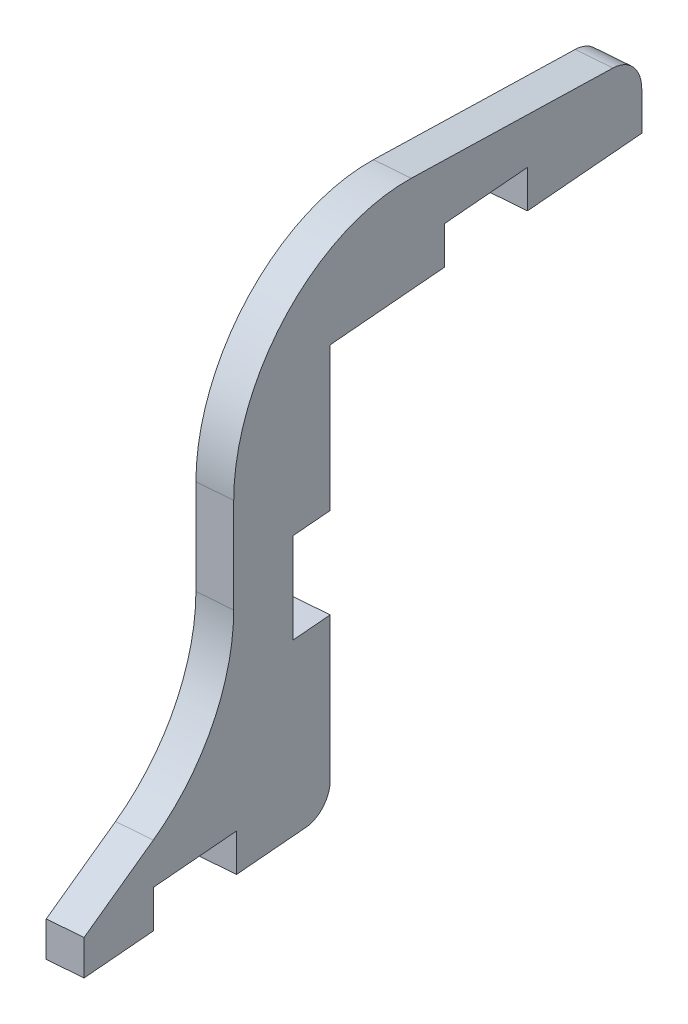
ISO-10303-21;
HEADER;
FILE_DESCRIPTION(('STEP AP214'),'2;1');
FILE_NAME('part.step','',(''),(''),'','','');
FILE_SCHEMA(('AUTOMOTIVE_DESIGN { 1 0 10303 214 1 1 1 1 }'));
ENDSEC;
DATA;
#1=APPLICATION_CONTEXT('core data for automotive mechanical design processes');
#2=APPLICATION_PROTOCOL_DEFINITION('international standard','automotive_design',2000,#1);
#3=PRODUCT_CONTEXT('',#1,'mechanical');
#4=PRODUCT('Part','Part','',(#3));
#5=PRODUCT_RELATED_PRODUCT_CATEGORY('part','',(#4));
#6=PRODUCT_DEFINITION_FORMATION('','',#4);
#7=PRODUCT_DEFINITION_CONTEXT('part definition',#1,'design');
#8=PRODUCT_DEFINITION('design','',#6,#7);
#9=PRODUCT_DEFINITION_SHAPE('','',#8);
#10=(LENGTH_UNIT() NAMED_UNIT(*) SI_UNIT(.MILLI.,.METRE.));
#11=(NAMED_UNIT(*) PLANE_ANGLE_UNIT() SI_UNIT($,.RADIAN.));
#12=(NAMED_UNIT(*) SI_UNIT($,.STERADIAN.) SOLID_ANGLE_UNIT());
#13=UNCERTAINTY_MEASURE_WITH_UNIT(LENGTH_MEASURE(1.E-05),#10,'distance_accuracy_value','');
#14=(GEOMETRIC_REPRESENTATION_CONTEXT(3) GLOBAL_UNCERTAINTY_ASSIGNED_CONTEXT((#13)) GLOBAL_UNIT_ASSIGNED_CONTEXT((#10,
#11,#12)) REPRESENTATION_CONTEXT('',''));
#15=CARTESIAN_POINT('',(0.,0.,0.));
#16=DIRECTION('',(0.,0.,1.));
#17=DIRECTION('',(1.,0.,0.));
#18=AXIS2_PLACEMENT_3D('',#15,#16,#17);
#19=CARTESIAN_POINT('',(8.92550631393653,2.29999999999999,28.5603892389756));
#20=DIRECTION('',(0.0805540927453617,0.,0.996750238596399));
#21=DIRECTION('',(0.996750238596393,0.,-0.0805540927453612));
#22=AXIS2_PLACEMENT_3D('',#19,#20,#21);
#23=PLANE('',#22);
#24=DIRECTION('',(0.996750238596393,0.,-0.0805540927453612));
#25=VECTOR('',#24,1.);
#26=CARTESIAN_POINT('',(8.92550631393653,2.29999999999999,28.5603892389756));
#27=LINE('',#26,#25);
#28=CARTESIAN_POINT('',(9.22453138551544,2.3,28.536223011152));
#29=VERTEX_POINT('',#28);
#30=CARTESIAN_POINT('',(13.211532339901,2.29999999999999,28.2140066401706));
#31=VERTEX_POINT('',#30);
#32=EDGE_CURVE('E69',#29,#31,#27,.T.);
#33=ORIENTED_EDGE('',*,*,#32,.F.);
#34=DIRECTION('',(0.,0.999999999999997,0.));
#35=VECTOR('',#34,1.);
#36=CARTESIAN_POINT('',(9.22453138551544,2.29999999999999,28.536223011152));
#37=LINE('',#36,#35);
#38=CARTESIAN_POINT('',(9.22453138551544,-1.99999999999999,28.536223011152));
#39=VERTEX_POINT('',#38);
#40=EDGE_CURVE('E11',#39,#29,#37,.T.);
#41=ORIENTED_EDGE('',*,*,#40,.F.);
#42=DIRECTION('',(-0.996750238596393,0.,0.0805540927453612));
#43=VECTOR('',#42,1.);
#44=CARTESIAN_POINT('',(17.2537625019009,-1.99999999999999,27.8873268253492));
#45=LINE('',#44,#43);
#46=CARTESIAN_POINT('',(13.211532339901,-1.99999999999999,28.2140066401706));
#47=VERTEX_POINT('',#46);
#48=EDGE_CURVE('E283',#47,#39,#45,.T.);
#49=ORIENTED_EDGE('',*,*,#48,.F.);
#50=DIRECTION('',(0.,-0.999999999999997,0.));
#51=VECTOR('',#50,1.);
#52=CARTESIAN_POINT('',(13.211532339901,2.29999999999999,28.2140066401706));
#53=LINE('',#52,#51);
#54=EDGE_CURVE('E411',#31,#47,#53,.T.);
#55=ORIENTED_EDGE('',*,*,#54,.F.);
#56=EDGE_LOOP('',(#33,#41,#49,#55));
#57=FACE_BOUND('',#56,.T.);
#58=ADVANCED_FACE('F41',(#57),#23,.T.);
#59=CARTESIAN_POINT('',(15.,-1.99999999999999,0.));
#60=DIRECTION('',(0.,-0.999999999999997,0.));
#61=DIRECTION('',(0.,0.,-1.));
#62=AXIS2_PLACEMENT_3D('',#59,#60,#61);
#63=PLANE('',#62);
#64=DIRECTION('',(0.0805540927453617,0.,0.996750238596399));
#65=VECTOR('',#64,1.);
#66=CARTESIAN_POINT('',(6.97076888361447,-1.99999999999998,0.648896185802841));
#67=LINE('',#66,#65);
#68=CARTESIAN_POINT('',(8.07978248506317,-1.99999999999999,14.3714710938828));
#69=VERTEX_POINT('',#68);
#70=EDGE_CURVE('E45',#69,#39,#67,.T.);
#71=ORIENTED_EDGE('',*,*,#70,.F.);
#72=DIRECTION('',(-0.996750238596393,0.,0.0805540927453612));
#73=VECTOR('',#72,1.);
#74=CARTESIAN_POINT('',(12.0667834394488,-1.99999999999999,14.0492547229014));
#75=LINE('',#74,#73);
#76=CARTESIAN_POINT('',(12.0667834394488,-1.99999999999999,14.0492547229014));
#77=VERTEX_POINT('',#76);
#78=EDGE_CURVE('E274',#77,#69,#75,.T.);
#79=ORIENTED_EDGE('',*,*,#78,.F.);
#80=DIRECTION('',(-0.0805540927453617,0.,-0.996750238596399));
#81=VECTOR('',#80,1.);
#82=CARTESIAN_POINT('',(15.1886147464591,-1.99999999999998,52.6777836290187));
#83=LINE('',#82,#81);
#84=EDGE_CURVE('E496',#47,#77,#83,.T.);
#85=ORIENTED_EDGE('',*,*,#84,.F.);
#86=ORIENTED_EDGE('',*,*,#48,.T.);
#87=EDGE_LOOP('',(#71,#79,#85,#86));
#88=FACE_BOUND('',#87,.T.);
#89=ADVANCED_FACE('F449',(#88),#63,.T.);
#90=CARTESIAN_POINT('',(12.0667834394488,1.99999999999999,14.0492547229014));
#91=DIRECTION('',(0.0805540927453617,0.,0.996750238596399));
#92=DIRECTION('',(0.996750238596393,0.,-0.0805540927453612));
#93=AXIS2_PLACEMENT_3D('',#90,#91,#92);
#94=PLANE('',#93);
#95=DIRECTION('',(0.,0.999999999999997,0.));
#96=VECTOR('',#95,1.);
#97=CARTESIAN_POINT('',(8.07978248506317,1.99999999999999,14.3714710938828));
#98=LINE('',#97,#96);
#99=CARTESIAN_POINT('',(8.07978248506317,2.39769989590251,14.3714710938828));
#100=VERTEX_POINT('',#99);
#101=EDGE_CURVE('E280',#69,#100,#98,.T.);
#102=ORIENTED_EDGE('',*,*,#101,.T.);
#103=DIRECTION('',(-0.996750238596393,0.,0.0805540927453612));
#104=VECTOR('',#103,1.);
#105=CARTESIAN_POINT('',(12.0667834394488,2.3976998959025,14.0492547229014));
#106=LINE('',#105,#104);
#107=CARTESIAN_POINT('',(12.0667834394488,2.3976998959025,14.0492547229014));
#108=VERTEX_POINT('',#107);
#109=EDGE_CURVE('E271',#108,#100,#106,.T.);
#110=ORIENTED_EDGE('',*,*,#109,.F.);
#111=DIRECTION('',(0.,0.999999999999997,0.));
#112=VECTOR('',#111,1.);
#113=CARTESIAN_POINT('',(12.0667834394488,1.99999999999999,14.0492547229014));
#114=LINE('',#113,#112);
#115=EDGE_CURVE('E501',#77,#108,#114,.T.);
#116=ORIENTED_EDGE('',*,*,#115,.F.);
#117=ORIENTED_EDGE('',*,*,#78,.T.);
#118=EDGE_LOOP('',(#102,#110,#116,#117));
#119=FACE_BOUND('',#118,.T.);
#120=ADVANCED_FACE('F472',(#119),#94,.F.);
#121=CARTESIAN_POINT('',(12.3889998104302,2.3976998959025,18.036255677287));
#122=DIRECTION('',(-0.996750238596393,0.,0.0805540927453612));
#123=DIRECTION('',(0.0805540927453617,0.,0.996750238596399));
#124=AXIS2_PLACEMENT_3D('',#121,#122,#123);
#125=CYLINDRICAL_SURFACE('',#124,4.);
#126=CARTESIAN_POINT('',(8.40199885604462,2.39769989590251,18.3584720482684));
#127=DIRECTION('',(0.996750238596393,0.,-0.0805540927453612));
#128=DIRECTION('',(-0.0805540927453617,0.,-0.996750238596399));
#129=AXIS2_PLACEMENT_3D('',#126,#127,#128);
#130=CIRCLE('',#129,4.);
#131=CARTESIAN_POINT('',(8.36837858795782,6.37586636228327,17.9424657462281));
#132=VERTEX_POINT('',#131);
#133=EDGE_CURVE('E272',#100,#132,#130,.T.);
#134=ORIENTED_EDGE('',*,*,#133,.T.);
#135=DIRECTION('',(-0.996750238596393,0.,0.0805540927453612));
#136=VECTOR('',#135,1.);
#137=CARTESIAN_POINT('',(12.3553795423434,6.37586636228327,17.6202493752467));
#138=LINE('',#137,#136);
#139=CARTESIAN_POINT('',(12.3553795423434,6.37586636228327,17.6202493752467));
#140=VERTEX_POINT('',#139);
#141=EDGE_CURVE('E267',#140,#132,#138,.T.);
#142=ORIENTED_EDGE('',*,*,#141,.F.);
#143=CARTESIAN_POINT('',(12.3889998104302,2.3976998959025,18.036255677287));
#144=DIRECTION('',(0.996750238596393,0.,-0.0805540927453612));
#145=DIRECTION('',(-0.0805540927453617,0.,-0.996750238596399));
#146=AXIS2_PLACEMENT_3D('',#143,#144,#145);
#147=CIRCLE('',#146,4.);
#148=EDGE_CURVE('E504',#108,#140,#147,.T.);
#149=ORIENTED_EDGE('',*,*,#148,.F.);
#150=ORIENTED_EDGE('',*,*,#109,.T.);
#151=EDGE_LOOP('',(#134,#142,#149,#150));
#152=FACE_BOUND('',#151,.T.);
#153=ADVANCED_FACE('F535',(#152),#125,.T.);
#154=CARTESIAN_POINT('',(12.3553795423434,6.37586636228327,17.6202493752467));
#155=DIRECTION('',(0.00840506702170405,-0.994541616595192,0.104001575510072));
#156=DIRECTION('',(0.,-0.104005249308261,-0.994576748228277));
#157=AXIS2_PLACEMENT_3D('',#154,#155,#156);
#158=PLANE('',#157);
#159=DIRECTION('',(0.0801143976223315,0.104340657752463,0.991309593635309));
#160=VECTOR('',#159,1.);
#161=CARTESIAN_POINT('',(8.36837858795782,6.37586636228327,17.9424657462281));
#162=LINE('',#161,#160);
#163=CARTESIAN_POINT('',(10.3890797096765,9.00761908612201,42.9459665810275));
#164=VERTEX_POINT('',#163);
#165=EDGE_CURVE('E268',#132,#164,#162,.T.);
#166=ORIENTED_EDGE('',*,*,#165,.T.);
#167=DIRECTION('',(-0.996750238596393,0.,0.0805540927453612));
#168=VECTOR('',#167,1.);
#169=CARTESIAN_POINT('',(14.3760806640621,9.00761908612201,42.6237502100461));
#170=LINE('',#169,#168);
#171=CARTESIAN_POINT('',(14.3760806640621,9.00761908612201,42.6237502100461));
#172=VERTEX_POINT('',#171);
#173=EDGE_CURVE('E263',#172,#164,#170,.T.);
#174=ORIENTED_EDGE('',*,*,#173,.F.);
#175=DIRECTION('',(0.0801143976223315,0.104340657752463,0.991309593635309));
#176=VECTOR('',#175,1.);
#177=CARTESIAN_POINT('',(12.3553795423434,6.37586636228327,17.6202493752467));
#178=LINE('',#177,#176);
#179=EDGE_CURVE('E538',#140,#172,#178,.T.);
#180=ORIENTED_EDGE('',*,*,#179,.F.);
#181=ORIENTED_EDGE('',*,*,#141,.T.);
#182=EDGE_LOOP('',(#166,#174,#180,#181));
#183=FACE_BOUND('',#182,.T.);
#184=ADVANCED_FACE('F694',(#183),#158,.F.);
#185=CARTESIAN_POINT('',(14.5441820044962,-10.8832132457818,44.7037817202476));
#186=DIRECTION('',(-0.996750238596393,0.,0.0805540927453612));
#187=DIRECTION('',(0.0805540927453617,0.,0.996750238596399));
#188=AXIS2_PLACEMENT_3D('',#185,#186,#187);
#189=CYLINDRICAL_SURFACE('',#188,20.);
#190=CARTESIAN_POINT('',(10.5571810501106,-10.8832132457818,45.025998091229));
#191=DIRECTION('',(0.996750238596393,0.,-0.0805540927453612));
#192=DIRECTION('',(-0.0805540927453617,0.,-0.996750238596399));
#193=AXIS2_PLACEMENT_3D('',#190,#191,#192);
#194=CIRCLE('',#193,20.);
#195=CARTESIAN_POINT('',(12.1682629050178,-10.8832132457818,64.961002863157));
#196=VERTEX_POINT('',#195);
#197=EDGE_CURVE('E264',#164,#196,#194,.T.);
#198=ORIENTED_EDGE('',*,*,#197,.T.);
#199=DIRECTION('',(-0.996750238596393,0.,0.0805540927453612));
#200=VECTOR('',#199,1.);
#201=CARTESIAN_POINT('',(16.1552638594034,-10.8832132457818,64.6387864921755));
#202=LINE('',#201,#200);
#203=CARTESIAN_POINT('',(16.1552638594034,-10.8832132457818,64.6387864921755));
#204=VERTEX_POINT('',#203);
#205=EDGE_CURVE('E240',#204,#196,#202,.T.);
#206=ORIENTED_EDGE('',*,*,#205,.F.);
#207=CARTESIAN_POINT('',(14.5441820044962,-10.8832132457818,44.7037817202476));
#208=DIRECTION('',(0.996750238596393,0.,-0.0805540927453612));
#209=DIRECTION('',(-0.0805540927453617,0.,-0.996750238596399));
#210=AXIS2_PLACEMENT_3D('',#207,#208,#209);
#211=CIRCLE('',#210,20.);
#212=EDGE_CURVE('E541',#172,#204,#211,.T.);
#213=ORIENTED_EDGE('',*,*,#212,.F.);
#214=ORIENTED_EDGE('',*,*,#173,.T.);
#215=EDGE_LOOP('',(#198,#206,#213,#214));
#216=FACE_BOUND('',#215,.T.);
#217=ADVANCED_FACE('F686',(#216),#189,.T.);
#218=CARTESIAN_POINT('',(16.1552638594034,-10.8832132457818,64.6387864921755));
#219=DIRECTION('',(-0.0805540927453617,0.,-0.996750238596399));
#220=DIRECTION('',(-0.996750238596393,0.,0.0805540927453612));
#221=AXIS2_PLACEMENT_3D('',#218,#219,#220);
#222=PLANE('',#221);
#223=DIRECTION('',(0.,-0.999999999999997,0.));
#224=VECTOR('',#223,1.);
#225=CARTESIAN_POINT('',(12.1682629050178,-10.8832132457818,64.961002863157));
#226=LINE('',#225,#224);
#227=CARTESIAN_POINT('',(12.1682629050178,-21.7049434551083,64.9610028631568));
#228=VERTEX_POINT('',#227);
#229=EDGE_CURVE('E260',#196,#228,#226,.T.);
#230=ORIENTED_EDGE('',*,*,#229,.T.);
#231=DIRECTION('',(-0.996750238596393,0.,0.0805540927453612));
#232=VECTOR('',#231,1.);
#233=CARTESIAN_POINT('',(16.1552638594034,-21.7049434551083,64.6387864921756));
#234=LINE('',#233,#232);
#235=CARTESIAN_POINT('',(16.1552638594034,-21.7049434551083,64.6387864921756));
#236=VERTEX_POINT('',#235);
#237=EDGE_CURVE('E235',#236,#228,#234,.T.);
#238=ORIENTED_EDGE('',*,*,#237,.F.);
#239=DIRECTION('',(0.,-0.999999999999997,0.));
#240=VECTOR('',#239,1.);
#241=CARTESIAN_POINT('',(16.1552638594034,-10.8832132457818,64.6387864921755));
#242=LINE('',#241,#240);
#243=EDGE_CURVE('E545',#204,#236,#242,.T.);
#244=ORIENTED_EDGE('',*,*,#243,.F.);
#245=ORIENTED_EDGE('',*,*,#205,.T.);
#246=EDGE_LOOP('',(#230,#238,#244,#245));
#247=FACE_BOUND('',#246,.T.);
#248=ADVANCED_FACE('F679',(#247),#222,.F.);
#249=CARTESIAN_POINT('',(17.7663457143106,-21.7049434551083,84.5737912641035));
#250=DIRECTION('',(-0.996750238596393,0.,0.0805540927453612));
#251=DIRECTION('',(0.0805540927453617,0.,0.996750238596399));
#252=AXIS2_PLACEMENT_3D('',#249,#250,#251);
#253=CYLINDRICAL_SURFACE('',#252,20.);
#254=CARTESIAN_POINT('',(13.7793447599251,-21.7049434551083,84.8960076350849));
#255=DIRECTION('',(-0.996750238596393,0.,0.0805540927453612));
#256=DIRECTION('',(0.0805540927453617,0.,0.996750238596399));
#257=AXIS2_PLACEMENT_3D('',#254,#255,#256);
#258=CIRCLE('',#257,20.);
#259=CARTESIAN_POINT('',(12.9738038324715,-39.025451530797,74.9285052491208));
#260=VERTEX_POINT('',#259);
#261=EDGE_CURVE('E228',#228,#260,#258,.T.);
#262=ORIENTED_EDGE('',*,*,#261,.T.);
#263=DIRECTION('',(-0.996750238596393,0.,0.0805540927453612));
#264=VECTOR('',#263,1.);
#265=CARTESIAN_POINT('',(16.9608047868571,-39.025451530797,74.6062888781396));
#266=LINE('',#265,#264);
#267=CARTESIAN_POINT('',(16.9608047868571,-39.025451530797,74.6062888781396));
#268=VERTEX_POINT('',#267);
#269=EDGE_CURVE('E232',#268,#260,#266,.T.);
#270=ORIENTED_EDGE('',*,*,#269,.F.);
#271=CARTESIAN_POINT('',(17.7663457143106,-21.7049434551083,84.5737912641035));
#272=DIRECTION('',(-0.996750238596393,0.,0.0805540927453612));
#273=DIRECTION('',(0.0805540927453617,0.,0.996750238596399));
#274=AXIS2_PLACEMENT_3D('',#271,#272,#273);
#275=CIRCLE('',#274,20.);
#276=EDGE_CURVE('E547',#236,#268,#275,.T.);
#277=ORIENTED_EDGE('',*,*,#276,.F.);
#278=ORIENTED_EDGE('',*,*,#237,.T.);
#279=EDGE_LOOP('',(#262,#270,#277,#278));
#280=FACE_BOUND('',#279,.T.);
#281=ADVANCED_FACE('F230',(#280),#253,.F.);
#282=CARTESIAN_POINT('',(16.9608047868571,-39.025451530797,74.6062888781396));
#283=DIRECTION('',(-0.040277046372681,-0.866025403784435,-0.498375119298202));
#284=DIRECTION('',(0.,0.498779853940022,-0.866728710326117));
#285=AXIS2_PLACEMENT_3D('',#282,#283,#284);
#286=PLANE('',#285);
#287=DIRECTION('',(0.0697618906962911,-0.499999999999999,0.863211027852679));
#288=VECTOR('',#287,1.);
#289=CARTESIAN_POINT('',(12.9738038324715,-39.025451530797,74.9285052491208));
#290=LINE('',#289,#288);
#291=CARTESIAN_POINT('',(13.6678716456153,-43.9999999999998,83.5166754435282));
#292=VERTEX_POINT('',#291);
#293=EDGE_CURVE('E246',#260,#292,#290,.T.);
#294=ORIENTED_EDGE('',*,*,#293,.T.);
#295=DIRECTION('',(-0.996750238596393,0.,0.0805540927453612));
#296=VECTOR('',#295,1.);
#297=CARTESIAN_POINT('',(17.6548726000009,-43.9999999999998,83.1944590725466));
#298=LINE('',#297,#296);
#299=CARTESIAN_POINT('',(17.6548726000009,-43.9999999999998,83.1944590725466));
#300=VERTEX_POINT('',#299);
#301=EDGE_CURVE('E286',#300,#292,#298,.T.);
#302=ORIENTED_EDGE('',*,*,#301,.F.);
#303=DIRECTION('',(0.0697618906962911,-0.499999999999999,0.863211027852679));
#304=VECTOR('',#303,1.);
#305=CARTESIAN_POINT('',(16.9608047868571,-39.025451530797,74.6062888781396));
#306=LINE('',#305,#304);
#307=EDGE_CURVE('E248',#268,#300,#306,.T.);
#308=ORIENTED_EDGE('',*,*,#307,.F.);
#309=ORIENTED_EDGE('',*,*,#269,.T.);
#310=EDGE_LOOP('',(#294,#302,#308,#309));
#311=FACE_BOUND('',#310,.T.);
#312=ADVANCED_FACE('F244',(#311),#286,.F.);
#313=CARTESIAN_POINT('',(17.6548726000009,-43.9999999999998,83.1944590725466));
#314=DIRECTION('',(-0.0805540927453617,0.,-0.996750238596399));
#315=DIRECTION('',(-0.996750238596393,0.,0.0805540927453612));
#316=AXIS2_PLACEMENT_3D('',#313,#314,#315);
#317=PLANE('',#316);
#318=DIRECTION('',(0.,-0.999999999999997,0.));
#319=VECTOR('',#318,1.);
#320=CARTESIAN_POINT('',(13.6678716456153,-47.9999999999999,83.5166754435282));
#321=LINE('',#320,#319);
#322=CARTESIAN_POINT('',(13.6678716456153,-47.9999999999999,83.5166754435282));
#323=VERTEX_POINT('',#322);
#324=EDGE_CURVE('E249',#292,#323,#321,.T.);
#325=ORIENTED_EDGE('',*,*,#324,.T.);
#326=DIRECTION('',(-0.996750238596393,0.,0.0805540927453612));
#327=VECTOR('',#326,1.);
#328=CARTESIAN_POINT('',(17.6548726000009,-47.9999999999998,83.1944590725466));
#329=LINE('',#328,#327);
#330=CARTESIAN_POINT('',(17.6548726000009,-47.9999999999998,83.1944590725466));
#331=VERTEX_POINT('',#330);
#332=EDGE_CURVE('E308',#331,#323,#329,.T.);
#333=ORIENTED_EDGE('',*,*,#332,.F.);
#334=DIRECTION('',(0.,-0.999999999999997,0.));
#335=VECTOR('',#334,1.);
#336=CARTESIAN_POINT('',(17.6548726000009,-43.9999999999998,83.1944590725466));
#337=LINE('',#336,#335);
#338=EDGE_CURVE('E393',#300,#331,#337,.T.);
#339=ORIENTED_EDGE('',*,*,#338,.F.);
#340=ORIENTED_EDGE('',*,*,#301,.T.);
#341=EDGE_LOOP('',(#325,#333,#339,#340));
#342=FACE_BOUND('',#341,.T.);
#343=ADVANCED_FACE('F438',(#342),#317,.F.);
#344=CARTESIAN_POINT('',(15.,-47.9999999999998,56.0000000000002));
#345=DIRECTION('',(0.,-0.999999999999997,0.));
#346=DIRECTION('',(0.,0.,-1.));
#347=AXIS2_PLACEMENT_3D('',#344,#345,#346);
#348=PLANE('',#347);
#349=DIRECTION('',(0.0805540927453617,0.,0.996750238596399));
#350=VECTOR('',#349,1.);
#351=CARTESIAN_POINT('',(11.4671383087904,-47.9999999999998,56.2855143217534));
#352=LINE('',#351,#350);
#353=CARTESIAN_POINT('',(12.9721345636397,-47.9999999999998,74.9078502575536));
#354=VERTEX_POINT('',#353);
#355=EDGE_CURVE('E378',#354,#323,#352,.T.);
#356=ORIENTED_EDGE('',*,*,#355,.F.);
#357=DIRECTION('',(0.996750238596393,0.,-0.0805540927453612));
#358=VECTOR('',#357,1.);
#359=CARTESIAN_POINT('',(16.5049962548493,-47.9999999999998,74.6223359358003));
#360=LINE('',#359,#358);
#361=CARTESIAN_POINT('',(16.9591355180253,-47.9999999999998,74.5856338865722));
#362=VERTEX_POINT('',#361);
#363=EDGE_CURVE('E307',#354,#362,#360,.T.);
#364=ORIENTED_EDGE('',*,*,#363,.T.);
#365=DIRECTION('',(-0.0805540927453616,0.,-0.996750238596399));
#366=VECTOR('',#365,1.);
#367=CARTESIAN_POINT('',(15.4310649299438,-47.9999999999998,55.6777836290187));
#368=LINE('',#367,#366);
#369=EDGE_CURVE('E374',#331,#362,#368,.T.);
#370=ORIENTED_EDGE('',*,*,#369,.F.);
#371=ORIENTED_EDGE('',*,*,#332,.T.);
#372=EDGE_LOOP('',(#356,#364,#370,#371));
#373=FACE_BOUND('',#372,.T.);
#374=ADVANCED_FACE('F468',(#373),#348,.T.);
#375=CARTESIAN_POINT('',(12.6731094920607,-49.9335699268316,74.9320164853772));
#376=DIRECTION('',(-0.0805540927453617,0.,-0.996750238596399));
#377=DIRECTION('',(-0.996750238596393,0.,0.0805540927453612));
#378=AXIS2_PLACEMENT_3D('',#375,#376,#377);
#379=PLANE('',#378);
#380=ORIENTED_EDGE('',*,*,#363,.F.);
#381=DIRECTION('',(0.,0.999999999999997,0.));
#382=VECTOR('',#381,1.);
#383=CARTESIAN_POINT('',(12.9721345636397,-44.9999999999998,74.9078502575534));
#384=LINE('',#383,#382);
#385=CARTESIAN_POINT('',(12.9721345636397,-43.6999999999998,74.9078502575534));
#386=VERTEX_POINT('',#385);
#387=EDGE_CURVE('E311',#354,#386,#384,.T.);
#388=ORIENTED_EDGE('',*,*,#387,.T.);
#389=DIRECTION('',(0.996750238596393,0.,-0.0805540927453612));
#390=VECTOR('',#389,1.);
#391=CARTESIAN_POINT('',(12.6731094920607,-43.6999999999998,74.9320164853772));
#392=LINE('',#391,#390);
#393=CARTESIAN_POINT('',(16.9591355180253,-43.6999999999998,74.5856338865722));
#394=VERTEX_POINT('',#393);
#395=EDGE_CURVE('E365',#386,#394,#392,.T.);
#396=ORIENTED_EDGE('',*,*,#395,.T.);
#397=DIRECTION('',(0.,0.999999999999997,0.));
#398=VECTOR('',#397,1.);
#399=CARTESIAN_POINT('',(16.9591355180253,-49.9335699268316,74.5856338865722));
#400=LINE('',#399,#398);
#401=EDGE_CURVE('E369',#362,#394,#400,.T.);
#402=ORIENTED_EDGE('',*,*,#401,.F.);
#403=EDGE_LOOP('',(#380,#388,#396,#402));
#404=FACE_BOUND('',#403,.T.);
#405=ADVANCED_FACE('F465',(#404),#379,.T.);
#406=CARTESIAN_POINT('',(-17.6548726000008,-43.6999999999998,64.4361213507827));
#407=DIRECTION('',(0.,0.999999999999997,0.));
#408=DIRECTION('',(0.,0.,1.));
#409=AXIS2_PLACEMENT_3D('',#406,#407,#408);
#410=PLANE('',#409);
#411=DIRECTION('',(0.0805540927453617,0.,0.996750238596399));
#412=VECTOR('',#411,1.);
#413=CARTESIAN_POINT('',(11.4440639755582,-43.6999999999998,56.0000000000002));
#414=LINE('',#413,#412);
#415=CARTESIAN_POINT('',(12.1398010575338,-43.6999999999998,64.6088251859744));
#416=VERTEX_POINT('',#415);
#417=EDGE_CURVE('E377',#416,#386,#414,.T.);
#418=ORIENTED_EDGE('',*,*,#417,.F.);
#419=DIRECTION('',(0.996750238596393,0.,-0.0805540927453612));
#420=VECTOR('',#419,1.);
#421=CARTESIAN_POINT('',(11.8407759859549,-43.6999999999998,64.6329914137981));
#422=LINE('',#421,#420);
#423=CARTESIAN_POINT('',(16.1268020119194,-43.6999999999998,64.2866088149932));
#424=VERTEX_POINT('',#423);
#425=EDGE_CURVE('E58',#416,#424,#422,.T.);
#426=ORIENTED_EDGE('',*,*,#425,.T.);
#427=DIRECTION('',(0.0805540927453617,0.,0.996750238596399));
#428=VECTOR('',#427,1.);
#429=CARTESIAN_POINT('',(15.4310649299438,-43.6999999999998,55.6777836290188));
#430=LINE('',#429,#428);
#431=EDGE_CURVE('E513',#424,#394,#430,.T.);
#432=ORIENTED_EDGE('',*,*,#431,.T.);
#433=ORIENTED_EDGE('',*,*,#395,.F.);
#434=EDGE_LOOP('',(#418,#426,#432,#433));
#435=FACE_BOUND('',#434,.T.);
#436=ADVANCED_FACE('F453',(#435),#410,.F.);
#437=CARTESIAN_POINT('',(11.8407759859549,-43.6999999999998,64.6329914137981));
#438=DIRECTION('',(0.0805540927453617,0.,0.996750238596399));
#439=DIRECTION('',(0.996750238596393,0.,-0.0805540927453612));
#440=AXIS2_PLACEMENT_3D('',#437,#438,#439);
#441=PLANE('',#440);
#442=ORIENTED_EDGE('',*,*,#425,.F.);
#443=DIRECTION('',(0.,0.999999999999997,0.));
#444=VECTOR('',#443,1.);
#445=CARTESIAN_POINT('',(12.1398010575338,-43.6999999999998,64.6088251859744));
#446=LINE('',#445,#444);
#447=CARTESIAN_POINT('',(12.1398010575338,-47.9999999999998,64.6088251859744));
#448=VERTEX_POINT('',#447);
#449=EDGE_CURVE('E375',#448,#416,#446,.T.);
#450=ORIENTED_EDGE('',*,*,#449,.F.);
#451=DIRECTION('',(-0.996750238596393,0.,0.0805540927453612));
#452=VECTOR('',#451,1.);
#453=CARTESIAN_POINT('',(15.6726627487435,-47.9999999999998,64.3233108642212));
#454=LINE('',#453,#452);
#455=CARTESIAN_POINT('',(16.1268020119194,-47.9999999999998,64.2866088149932));
#456=VERTEX_POINT('',#455);
#457=EDGE_CURVE('E291',#456,#448,#454,.T.);
#458=ORIENTED_EDGE('',*,*,#457,.F.);
#459=DIRECTION('',(0.,-0.999999999999997,0.));
#460=VECTOR('',#459,1.);
#461=CARTESIAN_POINT('',(16.1268020119194,-43.6999999999998,64.2866088149932));
#462=LINE('',#461,#460);
#463=EDGE_CURVE('E373',#424,#456,#462,.T.);
#464=ORIENTED_EDGE('',*,*,#463,.F.);
#465=EDGE_LOOP('',(#442,#450,#458,#464));
#466=FACE_BOUND('',#465,.T.);
#467=ADVANCED_FACE('F450',(#466),#441,.T.);
#468=CARTESIAN_POINT('',(11.4440639755582,-47.9999999999998,56.0000000000002));
#469=VERTEX_POINT('',#468);
#470=EDGE_CURVE('E355',#469,#448,#352,.T.);
#471=ORIENTED_EDGE('',*,*,#470,.F.);
#472=DIRECTION('',(-0.996750238596393,0.,0.0805540927453612));
#473=VECTOR('',#472,1.);
#474=CARTESIAN_POINT('',(15.4310649299438,-47.9999999999998,55.6777836290187));
#475=LINE('',#474,#473);
#476=CARTESIAN_POINT('',(15.4310649299438,-47.9999999999998,55.6777836290187));
#477=VERTEX_POINT('',#476);
#478=EDGE_CURVE('E290',#477,#469,#475,.T.);
#479=ORIENTED_EDGE('',*,*,#478,.F.);
#480=EDGE_CURVE('E426',#456,#477,#368,.T.);
#481=ORIENTED_EDGE('',*,*,#480,.F.);
#482=ORIENTED_EDGE('',*,*,#457,.T.);
#483=EDGE_LOOP('',(#471,#479,#481,#482));
#484=FACE_BOUND('',#483,.T.);
#485=ADVANCED_FACE('F436',(#484),#348,.T.);
#486=CARTESIAN_POINT('',(15.4310649299438,-44.9999999999998,55.6777836290188));
#487=DIRECTION('',(0.996750238596393,0.,-0.0805540927453612));
#488=DIRECTION('',(-0.0805540927453617,0.,-0.996750238596399));
#489=AXIS2_PLACEMENT_3D('',#486,#487,#488);
#490=ELLIPSE('',#489,3.00978107035575,3.);
#491=DIRECTION('',(-0.996750238596393,0.,0.0805540927453612));
#492=VECTOR('',#491,1.);
#493=SURFACE_OF_LINEAR_EXTRUSION('',#490,#492);
#494=CARTESIAN_POINT('',(11.4440639755582,-44.9999999999998,56.0000000000002));
#495=DIRECTION('',(-0.996750238596393,0.,0.0805540927453612));
#496=DIRECTION('',(-0.0805540927453617,0.,-0.996750238596399));
#497=AXIS2_PLACEMENT_3D('',#494,#495,#496);
#498=ELLIPSE('',#497,3.00978107035574,3.);
#499=CARTESIAN_POINT('',(11.2016137920735,-44.9999999999998,53.0000000000002));
#500=VERTEX_POINT('',#499);
#501=EDGE_CURVE('E287',#469,#500,#498,.F.);
#502=ORIENTED_EDGE('',*,*,#501,.T.);
#503=DIRECTION('',(-0.996750238596393,0.,0.0805540927453612));
#504=VECTOR('',#503,1.);
#505=CARTESIAN_POINT('',(15.1886147464591,-44.9999999999998,52.6777836290187));
#506=LINE('',#505,#504);
#507=CARTESIAN_POINT('',(15.1886147464591,-44.9999999999998,52.6777836290187));
#508=VERTEX_POINT('',#507);
#509=EDGE_CURVE('E313',#508,#500,#506,.T.);
#510=ORIENTED_EDGE('',*,*,#509,.F.);
#511=EDGE_CURVE('E424',#477,#508,#490,.T.);
#512=ORIENTED_EDGE('',*,*,#511,.F.);
#513=ORIENTED_EDGE('',*,*,#478,.T.);
#514=EDGE_LOOP('',(#502,#510,#512,#513));
#515=FACE_BOUND('',#514,.T.);
#516=ADVANCED_FACE('F431',(#515),#493,.F.);
#517=CARTESIAN_POINT('',(15.1886147464591,-44.9999999999998,52.6777836290187));
#518=DIRECTION('',(0.0805540927453617,0.,0.996750238596399));
#519=DIRECTION('',(0.996750238596393,0.,-0.0805540927453612));
#520=AXIS2_PLACEMENT_3D('',#517,#518,#519);
#521=PLANE('',#520);
#522=DIRECTION('',(0.,0.999999999999997,0.));
#523=VECTOR('',#522,1.);
#524=CARTESIAN_POINT('',(11.2016137920735,-0.999999999999989,53.0000000000002));
#525=LINE('',#524,#523);
#526=CARTESIAN_POINT('',(11.2016137920735,-28.6499999999999,53.0000000000001));
#527=VERTEX_POINT('',#526);
#528=EDGE_CURVE('E292',#500,#527,#525,.T.);
#529=ORIENTED_EDGE('',*,*,#528,.T.);
#530=DIRECTION('',(0.996750238596393,0.,-0.0805540927453612));
#531=VECTOR('',#530,1.);
#532=CARTESIAN_POINT('',(15.1886147464591,-28.6499999999999,52.6777836290187));
#533=LINE('',#532,#531);
#534=CARTESIAN_POINT('',(15.1886147464591,-28.6499999999999,52.6777836290187));
#535=VERTEX_POINT('',#534);
#536=EDGE_CURVE('E295',#527,#535,#533,.T.);
#537=ORIENTED_EDGE('',*,*,#536,.T.);
#538=DIRECTION('',(0.,0.999999999999997,0.));
#539=VECTOR('',#538,1.);
#540=CARTESIAN_POINT('',(15.1886147464591,-44.9999999999998,52.6777836290187));
#541=LINE('',#540,#539);
#542=EDGE_CURVE('E277',#508,#535,#541,.T.);
#543=ORIENTED_EDGE('',*,*,#542,.F.);
#544=ORIENTED_EDGE('',*,*,#509,.T.);
#545=EDGE_LOOP('',(#529,#537,#543,#544));
#546=FACE_BOUND('',#545,.T.);
#547=ADVANCED_FACE('F435',(#546),#521,.F.);
#548=CARTESIAN_POINT('',(11.2761411229114,-28.6499999999999,57.6463825988052));
#549=DIRECTION('',(0.,-0.999999999999997,0.));
#550=DIRECTION('',(0.999999999999997,0.,0.));
#551=AXIS2_PLACEMENT_3D('',#548,#549,#550);
#552=PLANE('',#551);
#553=ORIENTED_EDGE('',*,*,#536,.F.);
#554=DIRECTION('',(-0.0805540927453617,0.,-0.996750238596399));
#555=VECTOR('',#554,1.);
#556=CARTESIAN_POINT('',(11.4440639755582,-28.6499999999999,56.0000000000002));
#557=LINE('',#556,#555);
#558=CARTESIAN_POINT('',(11.5751661944903,-28.6499999999999,57.6222163709816));
#559=VERTEX_POINT('',#558);
#560=EDGE_CURVE('E353',#559,#527,#557,.T.);
#561=ORIENTED_EDGE('',*,*,#560,.F.);
#562=DIRECTION('',(0.996750238596393,0.,-0.0805540927453612));
#563=VECTOR('',#562,1.);
#564=CARTESIAN_POINT('',(11.2761411229114,-28.6499999999999,57.6463825988052));
#565=LINE('',#564,#563);
#566=CARTESIAN_POINT('',(15.5621671488759,-28.6499999999999,57.3000000000002));
#567=VERTEX_POINT('',#566);
#568=EDGE_CURVE('E315',#559,#567,#565,.T.);
#569=ORIENTED_EDGE('',*,*,#568,.T.);
#570=DIRECTION('',(-0.0805540927453617,0.,-0.996750238596399));
#571=VECTOR('',#570,1.);
#572=CARTESIAN_POINT('',(15.5621671488759,-28.6499999999999,57.3000000000002));
#573=LINE('',#572,#571);
#574=EDGE_CURVE('E320',#567,#535,#573,.T.);
#575=ORIENTED_EDGE('',*,*,#574,.T.);
#576=EDGE_LOOP('',(#553,#561,#569,#575));
#577=FACE_BOUND('',#576,.T.);
#578=ADVANCED_FACE('F418',(#577),#552,.F.);
#579=CARTESIAN_POINT('',(11.2761411229114,-28.3499999999999,57.6463825988052));
#580=DIRECTION('',(0.0805540927453617,0.,0.996750238596399));
#581=DIRECTION('',(0.996750238596393,0.,-0.0805540927453612));
#582=AXIS2_PLACEMENT_3D('',#579,#580,#581);
#583=PLANE('',#582);
#584=ORIENTED_EDGE('',*,*,#568,.F.);
#585=DIRECTION('',(0.,-0.999999999999997,0.));
#586=VECTOR('',#585,1.);
#587=CARTESIAN_POINT('',(11.5751661944903,-44.9999999999998,57.6222163709816));
#588=LINE('',#587,#586);
#589=CARTESIAN_POINT('',(11.5751661944903,-18.3499999999999,57.6222163709816));
#590=VERTEX_POINT('',#589);
#591=EDGE_CURVE('E356',#590,#559,#588,.T.);
#592=ORIENTED_EDGE('',*,*,#591,.F.);
#593=DIRECTION('',(0.996750238596393,0.,-0.0805540927453612));
#594=VECTOR('',#593,1.);
#595=CARTESIAN_POINT('',(11.2761411229114,-18.3499999999999,57.6463825988052));
#596=LINE('',#595,#594);
#597=CARTESIAN_POINT('',(15.5621671488759,-18.3499999999999,57.3000000000001));
#598=VERTEX_POINT('',#597);
#599=EDGE_CURVE('E341',#590,#598,#596,.T.);
#600=ORIENTED_EDGE('',*,*,#599,.T.);
#601=DIRECTION('',(0.,-0.999999999999997,0.));
#602=VECTOR('',#601,1.);
#603=CARTESIAN_POINT('',(15.5621671488759,-28.3499999999999,57.3000000000002));
#604=LINE('',#603,#602);
#605=EDGE_CURVE('E349',#598,#567,#604,.T.);
#606=ORIENTED_EDGE('',*,*,#605,.T.);
#607=EDGE_LOOP('',(#584,#592,#600,#606));
#608=FACE_BOUND('',#607,.T.);
#609=ADVANCED_FACE('F419',(#608),#583,.F.);
#610=CARTESIAN_POINT('',(10.673915039266,-18.3499999999999,50.194632202212));
#611=DIRECTION('',(0.,0.999999999999997,0.));
#612=DIRECTION('',(-0.999999999999997,0.,0.));
#613=AXIS2_PLACEMENT_3D('',#610,#611,#612);
#614=PLANE('',#613);
#615=DIRECTION('',(0.0805540927453617,0.,0.996750238596399));
#616=VECTOR('',#615,1.);
#617=CARTESIAN_POINT('',(11.4440639755582,-18.3499999999999,56.0000000000002));
#618=LINE('',#617,#616);
#619=CARTESIAN_POINT('',(11.2016137920735,-18.3499999999999,53.0000000000002));
#620=VERTEX_POINT('',#619);
#621=EDGE_CURVE('E383',#620,#590,#618,.T.);
#622=ORIENTED_EDGE('',*,*,#621,.F.);
#623=DIRECTION('',(-0.996750238596393,0.,0.0805540927453612));
#624=VECTOR('',#623,1.);
#625=CARTESIAN_POINT('',(15.1886147464591,-18.3499999999999,52.6777836290187));
#626=LINE('',#625,#624);
#627=CARTESIAN_POINT('',(15.1886147464591,-18.3499999999999,52.6777836290187));
#628=VERTEX_POINT('',#627);
#629=EDGE_CURVE('E328',#628,#620,#626,.T.);
#630=ORIENTED_EDGE('',*,*,#629,.F.);
#631=DIRECTION('',(0.0805540927453617,0.,0.996750238596399));
#632=VECTOR('',#631,1.);
#633=CARTESIAN_POINT('',(14.9599410652305,-18.3499999999999,49.848249603407));
#634=LINE('',#633,#632);
#635=EDGE_CURVE('E331',#628,#598,#634,.T.);
#636=ORIENTED_EDGE('',*,*,#635,.T.);
#637=ORIENTED_EDGE('',*,*,#599,.F.);
#638=EDGE_LOOP('',(#622,#630,#636,#637));
#639=FACE_BOUND('',#638,.T.);
#640=ADVANCED_FACE('F444',(#639),#614,.F.);
#641=CARTESIAN_POINT('',(15.1886147464591,-1.99999999999998,52.6777836290187));
#642=VERTEX_POINT('',#641);
#643=EDGE_CURVE('E425',#628,#642,#541,.T.);
#644=ORIENTED_EDGE('',*,*,#643,.F.);
#645=ORIENTED_EDGE('',*,*,#629,.T.);
#646=CARTESIAN_POINT('',(11.2016137920735,-1.99999999999998,53.0000000000002));
#647=VERTEX_POINT('',#646);
#648=EDGE_CURVE('E296',#620,#647,#525,.T.);
#649=ORIENTED_EDGE('',*,*,#648,.T.);
#650=DIRECTION('',(-0.996750238596393,0.,0.0805540927453612));
#651=VECTOR('',#650,1.);
#652=CARTESIAN_POINT('',(15.1886147464591,-1.99999999999998,52.6777836290187));
#653=LINE('',#652,#651);
#654=EDGE_CURVE('E257',#642,#647,#653,.T.);
#655=ORIENTED_EDGE('',*,*,#654,.F.);
#656=EDGE_LOOP('',(#644,#645,#649,#655));
#657=FACE_BOUND('',#656,.T.);
#658=ADVANCED_FACE('F440',(#657),#521,.F.);
#659=CARTESIAN_POINT('',(10.0568648916213,-1.99999999999999,38.835248082731));
#660=VERTEX_POINT('',#659);
#661=EDGE_CURVE('E380',#660,#647,#67,.T.);
#662=ORIENTED_EDGE('',*,*,#661,.F.);
#663=DIRECTION('',(0.996750238596393,0.,-0.0805540927453612));
#664=VECTOR('',#663,1.);
#665=CARTESIAN_POINT('',(18.0860960080068,-1.99999999999999,38.1863518969282));
#666=LINE('',#665,#664);
#667=CARTESIAN_POINT('',(14.0438658460068,-1.99999999999999,38.5130317117496));
#668=VERTEX_POINT('',#667);
#669=EDGE_CURVE('E339',#660,#668,#666,.T.);
#670=ORIENTED_EDGE('',*,*,#669,.T.);
#671=EDGE_CURVE('E412',#642,#668,#83,.T.);
#672=ORIENTED_EDGE('',*,*,#671,.F.);
#673=ORIENTED_EDGE('',*,*,#654,.T.);
#674=EDGE_LOOP('',(#662,#670,#672,#673));
#675=FACE_BOUND('',#674,.T.);
#676=ADVANCED_FACE('F443',(#675),#63,.T.);
#677=CARTESIAN_POINT('',(9.75783982004234,-4.38977617992702,38.8594143105545));
#678=DIRECTION('',(-0.0805540927453617,0.,-0.996750238596399));
#679=DIRECTION('',(-0.996750238596393,0.,0.0805540927453612));
#680=AXIS2_PLACEMENT_3D('',#677,#678,#679);
#681=PLANE('',#680);
#682=ORIENTED_EDGE('',*,*,#669,.F.);
#683=DIRECTION('',(0.,0.999999999999997,0.));
#684=VECTOR('',#683,1.);
#685=CARTESIAN_POINT('',(10.0568648916213,-44.9999999999998,38.8352480827309));
#686=LINE('',#685,#684);
#687=CARTESIAN_POINT('',(10.0568648916213,2.3,38.835248082731));
#688=VERTEX_POINT('',#687);
#689=EDGE_CURVE('E402',#660,#688,#686,.T.);
#690=ORIENTED_EDGE('',*,*,#689,.T.);
#691=DIRECTION('',(0.996750238596393,0.,-0.0805540927453612));
#692=VECTOR('',#691,1.);
#693=CARTESIAN_POINT('',(9.75783982004235,2.3,38.8594143105546));
#694=LINE('',#693,#692);
#695=CARTESIAN_POINT('',(14.0438658460068,2.3,38.5130317117496));
#696=VERTEX_POINT('',#695);
#697=EDGE_CURVE('E404',#688,#696,#694,.T.);
#698=ORIENTED_EDGE('',*,*,#697,.T.);
#699=DIRECTION('',(0.,0.999999999999997,0.));
#700=VECTOR('',#699,1.);
#701=CARTESIAN_POINT('',(14.0438658460068,-4.389776179927,38.5130317117495));
#702=LINE('',#701,#700);
#703=EDGE_CURVE('E408',#668,#696,#702,.T.);
#704=ORIENTED_EDGE('',*,*,#703,.F.);
#705=EDGE_LOOP('',(#682,#690,#698,#704));
#706=FACE_BOUND('',#705,.T.);
#707=ADVANCED_FACE('F454',(#706),#681,.T.);
#708=CARTESIAN_POINT('',(-17.6548726000009,2.3,28.36351917596));
#709=DIRECTION('',(0.,0.999999999999997,0.));
#710=DIRECTION('',(0.,0.,1.));
#711=AXIS2_PLACEMENT_3D('',#708,#709,#710);
#712=PLANE('',#711);
#713=DIRECTION('',(0.0805540927453617,0.,0.996750238596399));
#714=VECTOR('',#713,1.);
#715=CARTESIAN_POINT('',(11.4440639755582,2.30000000000001,56.0000000000002));
#716=LINE('',#715,#714);
#717=EDGE_CURVE('E384',#29,#688,#716,.T.);
#718=ORIENTED_EDGE('',*,*,#717,.F.);
#719=ORIENTED_EDGE('',*,*,#32,.T.);
#720=DIRECTION('',(0.0805540927453617,0.,0.996750238596399));
#721=VECTOR('',#720,1.);
#722=CARTESIAN_POINT('',(15.4310649299438,2.3,55.6777836290187));
#723=LINE('',#722,#721);
#724=EDGE_CURVE('E485',#31,#696,#723,.T.);
#725=ORIENTED_EDGE('',*,*,#724,.T.);
#726=ORIENTED_EDGE('',*,*,#697,.F.);
#727=EDGE_LOOP('',(#718,#719,#725,#726));
#728=FACE_BOUND('',#727,.T.);
#729=ADVANCED_FACE('F457',(#728),#712,.F.);
#730=CARTESIAN_POINT('',(15.4310649299438,-44.9999999999998,55.6777836290188));
#731=DIRECTION('',(0.996750238596393,0.,-0.0805540927453612));
#732=DIRECTION('',(-0.0805540927453617,0.,-0.996750238596399));
#733=AXIS2_PLACEMENT_3D('',#730,#731,#732);
#734=PLANE('',#733);
#735=ORIENTED_EDGE('',*,*,#369,.T.);
#736=ORIENTED_EDGE('',*,*,#401,.T.);
#737=ORIENTED_EDGE('',*,*,#431,.F.);
#738=ORIENTED_EDGE('',*,*,#463,.T.);
#739=ORIENTED_EDGE('',*,*,#480,.T.);
#740=ORIENTED_EDGE('',*,*,#511,.T.);
#741=ORIENTED_EDGE('',*,*,#542,.T.);
#742=ORIENTED_EDGE('',*,*,#574,.F.);
#743=ORIENTED_EDGE('',*,*,#605,.F.);
#744=ORIENTED_EDGE('',*,*,#635,.F.);
#745=ORIENTED_EDGE('',*,*,#643,.T.);
#746=ORIENTED_EDGE('',*,*,#671,.T.);
#747=ORIENTED_EDGE('',*,*,#703,.T.);
#748=ORIENTED_EDGE('',*,*,#724,.F.);
#749=ORIENTED_EDGE('',*,*,#54,.T.);
#750=ORIENTED_EDGE('',*,*,#84,.T.);
#751=ORIENTED_EDGE('',*,*,#115,.T.);
#752=ORIENTED_EDGE('',*,*,#148,.T.);
#753=ORIENTED_EDGE('',*,*,#179,.T.);
#754=ORIENTED_EDGE('',*,*,#212,.T.);
#755=ORIENTED_EDGE('',*,*,#243,.T.);
#756=ORIENTED_EDGE('',*,*,#276,.T.);
#757=ORIENTED_EDGE('',*,*,#307,.T.);
#758=ORIENTED_EDGE('',*,*,#338,.T.);
#759=EDGE_LOOP('',(#735,#736,#737,#738,#739,#740,#741,#742,#743,#744,#745,#746,#747,#748,#749,
#750,#751,#752,#753,#754,#755,#756,#757,#758));
#760=FACE_BOUND('',#759,.T.);
#761=ADVANCED_FACE('F43',(#760),#734,.T.);
#762=CARTESIAN_POINT('',(11.4440639755582,-44.9999999999998,56.0000000000002));
#763=DIRECTION('',(0.996750238596393,0.,-0.0805540927453612));
#764=DIRECTION('',(-0.0805540927453617,0.,-0.996750238596399));
#765=AXIS2_PLACEMENT_3D('',#762,#763,#764);
#766=PLANE('',#765);
#767=ORIENTED_EDGE('',*,*,#591,.T.);
#768=ORIENTED_EDGE('',*,*,#560,.T.);
#769=ORIENTED_EDGE('',*,*,#528,.F.);
#770=ORIENTED_EDGE('',*,*,#501,.F.);
#771=ORIENTED_EDGE('',*,*,#470,.T.);
#772=ORIENTED_EDGE('',*,*,#449,.T.);
#773=ORIENTED_EDGE('',*,*,#417,.T.);
#774=ORIENTED_EDGE('',*,*,#387,.F.);
#775=ORIENTED_EDGE('',*,*,#355,.T.);
#776=ORIENTED_EDGE('',*,*,#324,.F.);
#777=ORIENTED_EDGE('',*,*,#293,.F.);
#778=ORIENTED_EDGE('',*,*,#261,.F.);
#779=ORIENTED_EDGE('',*,*,#229,.F.);
#780=ORIENTED_EDGE('',*,*,#197,.F.);
#781=ORIENTED_EDGE('',*,*,#165,.F.);
#782=ORIENTED_EDGE('',*,*,#133,.F.);
#783=ORIENTED_EDGE('',*,*,#101,.F.);
#784=ORIENTED_EDGE('',*,*,#70,.T.);
#785=ORIENTED_EDGE('',*,*,#40,.T.);
#786=ORIENTED_EDGE('',*,*,#717,.T.);
#787=ORIENTED_EDGE('',*,*,#689,.F.);
#788=ORIENTED_EDGE('',*,*,#661,.T.);
#789=ORIENTED_EDGE('',*,*,#648,.F.);
#790=ORIENTED_EDGE('',*,*,#621,.T.);
#791=EDGE_LOOP('',(#767,#768,#769,#770,#771,#772,#773,#774,#775,#776,#777,#778,#779,#780,#781,
#782,#783,#784,#785,#786,#787,#788,#789,#790));
#792=FACE_BOUND('',#791,.T.);
#793=ADVANCED_FACE('F251',(#792),#766,.F.);
#794=CLOSED_SHELL('',(#58,#89,#120,#153,#184,#217,#248,#281,#312,#343,#374,#405,#436,#467,#485,
#516,#547,#578,#609,#640,#658,#676,#707,#729,#761,#793));
#795=MANIFOLD_SOLID_BREP('B2',#794);
#796=ADVANCED_BREP_SHAPE_REPRESENTATION('',(#18,#795),#14);
#797=SHAPE_DEFINITION_REPRESENTATION(#9,#796);
ENDSEC;
END-ISO-10303-21;
